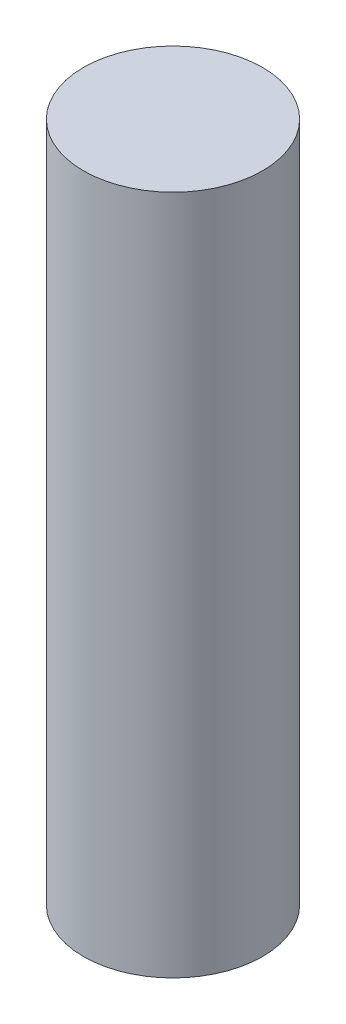
ISO-10303-21;
HEADER;
FILE_DESCRIPTION(('STEP AP214'),'2;1');
FILE_NAME('part.step','',(''),(''),'','','');
FILE_SCHEMA(('AUTOMOTIVE_DESIGN { 1 0 10303 214 1 1 1 1 }'));
ENDSEC;
DATA;
#1=APPLICATION_CONTEXT('core data for automotive mechanical design processes');
#2=APPLICATION_PROTOCOL_DEFINITION('international standard','automotive_design',2000,#1);
#3=PRODUCT_CONTEXT('',#1,'mechanical');
#4=PRODUCT('Part','Part','',(#3));
#5=PRODUCT_RELATED_PRODUCT_CATEGORY('part','',(#4));
#6=PRODUCT_DEFINITION_FORMATION('','',#4);
#7=PRODUCT_DEFINITION_CONTEXT('part definition',#1,'design');
#8=PRODUCT_DEFINITION('design','',#6,#7);
#9=PRODUCT_DEFINITION_SHAPE('','',#8);
#10=(LENGTH_UNIT() NAMED_UNIT(*) SI_UNIT(.MILLI.,.METRE.));
#11=(NAMED_UNIT(*) PLANE_ANGLE_UNIT() SI_UNIT($,.RADIAN.));
#12=(NAMED_UNIT(*) SI_UNIT($,.STERADIAN.) SOLID_ANGLE_UNIT());
#13=UNCERTAINTY_MEASURE_WITH_UNIT(LENGTH_MEASURE(1.E-05),#10,'distance_accuracy_value','');
#14=(GEOMETRIC_REPRESENTATION_CONTEXT(3) GLOBAL_UNCERTAINTY_ASSIGNED_CONTEXT((#13)) GLOBAL_UNIT_ASSIGNED_CONTEXT((#10,
#11,#12)) REPRESENTATION_CONTEXT('',''));
#15=CARTESIAN_POINT('',(0.,0.,0.));
#16=DIRECTION('',(0.,0.,1.));
#17=DIRECTION('',(1.,0.,0.));
#18=AXIS2_PLACEMENT_3D('',#15,#16,#17);
#19=CARTESIAN_POINT('',(0.,96.52,0.));
#20=DIRECTION('',(0.,-1.,0.));
#21=DIRECTION('',(0.,0.,-1.));
#22=AXIS2_PLACEMENT_3D('',#19,#20,#21);
#23=CYLINDRICAL_SURFACE('',#22,12.7);
#24=CARTESIAN_POINT('',(0.,96.52,0.));
#25=DIRECTION('',(0.,1.,0.));
#26=DIRECTION('',(0.,0.,1.));
#27=AXIS2_PLACEMENT_3D('',#24,#25,#26);
#28=CIRCLE('',#27,12.7);
#29=CARTESIAN_POINT('',(0.,96.52,-12.7));
#30=VERTEX_POINT('',#29);
#31=EDGE_CURVE('E10',#30,#30,#28,.T.);
#32=CARTESIAN_POINT('',(0.,0.,0.));
#33=DIRECTION('',(0.,1.,0.));
#34=DIRECTION('',(0.,0.,1.));
#35=AXIS2_PLACEMENT_3D('',#32,#33,#34);
#36=CIRCLE('',#35,12.7);
#37=CARTESIAN_POINT('',(0.,0.,-12.7));
#38=VERTEX_POINT('',#37);
#39=EDGE_CURVE('E46',#38,#38,#36,.T.);
#40=CARTESIAN_POINT('',(0.,96.52,-12.7));
#41=CARTESIAN_POINT('',(0.,95.5145833333333,-12.7));
#42=CARTESIAN_POINT('',(0.,94.5091666666666,-12.7));
#43=CARTESIAN_POINT('',(0.,92.4983333333333,-12.7));
#44=CARTESIAN_POINT('',(0.,91.4929166666666,-12.7));
#45=CARTESIAN_POINT('',(0.,89.4820833333333,-12.7));
#46=CARTESIAN_POINT('',(0.,88.4766666666666,-12.7));
#47=CARTESIAN_POINT('',(0.,86.4658333333333,-12.7));
#48=CARTESIAN_POINT('',(0.,85.4604166666666,-12.7));
#49=CARTESIAN_POINT('',(0.,83.4495833333333,-12.7));
#50=CARTESIAN_POINT('',(0.,82.4441666666666,-12.7));
#51=CARTESIAN_POINT('',(0.,80.4333333333333,-12.7));
#52=CARTESIAN_POINT('',(0.,79.4279166666666,-12.7));
#53=CARTESIAN_POINT('',(0.,77.4170833333333,-12.7));
#54=CARTESIAN_POINT('',(0.,76.4116666666667,-12.7));
#55=CARTESIAN_POINT('',(0.,74.4008333333333,-12.7));
#56=CARTESIAN_POINT('',(0.,73.3954166666667,-12.7));
#57=CARTESIAN_POINT('',(0.,71.3845833333333,-12.7));
#58=CARTESIAN_POINT('',(0.,70.3791666666666,-12.7));
#59=CARTESIAN_POINT('',(0.,68.3683333333333,-12.7));
#60=CARTESIAN_POINT('',(0.,67.3629166666666,-12.7));
#61=CARTESIAN_POINT('',(0.,65.3520833333333,-12.7));
#62=CARTESIAN_POINT('',(0.,64.3466666666666,-12.7));
#63=CARTESIAN_POINT('',(0.,62.3358333333333,-12.7));
#64=CARTESIAN_POINT('',(0.,61.3304166666667,-12.7));
#65=CARTESIAN_POINT('',(0.,59.3195833333333,-12.7));
#66=CARTESIAN_POINT('',(0.,58.3141666666667,-12.7));
#67=CARTESIAN_POINT('',(0.,56.3033333333333,-12.7));
#68=CARTESIAN_POINT('',(0.,55.2979166666667,-12.7));
#69=CARTESIAN_POINT('',(0.,53.2870833333333,-12.7));
#70=CARTESIAN_POINT('',(0.,52.2816666666667,-12.7));
#71=CARTESIAN_POINT('',(0.,50.2708333333333,-12.7));
#72=CARTESIAN_POINT('',(0.,49.2654166666667,-12.7));
#73=CARTESIAN_POINT('',(0.,47.2545833333333,-12.7));
#74=CARTESIAN_POINT('',(0.,46.2491666666667,-12.7));
#75=CARTESIAN_POINT('',(0.,44.2383333333333,-12.7));
#76=CARTESIAN_POINT('',(0.,43.2329166666667,-12.7));
#77=CARTESIAN_POINT('',(0.,41.2220833333333,-12.7));
#78=CARTESIAN_POINT('',(0.,40.2166666666667,-12.7));
#79=CARTESIAN_POINT('',(0.,38.2058333333333,-12.7));
#80=CARTESIAN_POINT('',(0.,37.2004166666667,-12.7));
#81=CARTESIAN_POINT('',(0.,35.1895833333333,-12.7));
#82=CARTESIAN_POINT('',(0.,34.1841666666667,-12.7));
#83=CARTESIAN_POINT('',(0.,32.1733333333333,-12.7));
#84=CARTESIAN_POINT('',(0.,31.1679166666667,-12.7));
#85=CARTESIAN_POINT('',(0.,29.1570833333333,-12.7));
#86=CARTESIAN_POINT('',(0.,28.1516666666667,-12.7));
#87=CARTESIAN_POINT('',(0.,26.1408333333333,-12.7));
#88=CARTESIAN_POINT('',(0.,25.1354166666667,-12.7));
#89=CARTESIAN_POINT('',(0.,23.1245833333333,-12.7));
#90=CARTESIAN_POINT('',(0.,22.1191666666667,-12.7));
#91=CARTESIAN_POINT('',(0.,20.1083333333333,-12.7));
#92=CARTESIAN_POINT('',(0.,19.1029166666667,-12.7));
#93=CARTESIAN_POINT('',(0.,17.0920833333333,-12.7));
#94=CARTESIAN_POINT('',(0.,16.0866666666667,-12.7));
#95=CARTESIAN_POINT('',(0.,14.0758333333333,-12.7));
#96=CARTESIAN_POINT('',(0.,13.0704166666667,-12.7));
#97=CARTESIAN_POINT('',(0.,11.0595833333333,-12.7));
#98=CARTESIAN_POINT('',(0.,10.0541666666667,-12.7));
#99=CARTESIAN_POINT('',(0.,8.04333333333331,-12.7));
#100=CARTESIAN_POINT('',(0.,7.03791666666665,-12.7));
#101=CARTESIAN_POINT('',(0.,5.02708333333332,-12.7));
#102=CARTESIAN_POINT('',(0.,4.02166666666665,-12.7));
#103=CARTESIAN_POINT('',(0.,2.01083333333332,-12.7));
#104=CARTESIAN_POINT('',(0.,1.00541666666665,-12.7));
#105=CARTESIAN_POINT('',(0.,0.,-12.7));
#106=B_SPLINE_CURVE_WITH_KNOTS('',3,(#40,#41,#42,#43,#44,#45,#46,#47,#48,#49,#50,#51,#52,#53,
#54,#55,#56,#57,#58,#59,#60,#61,#62,#63,#64,#65,#66,#67,#68,#69,#70,#71,#72,#73,#74,#75,#76,#77,
#78,#79,#80,#81,#82,#83,#84,#85,#86,#87,#88,#89,#90,#91,#92,#93,#94,#95,#96,#97,#98,#99,#100,
#101,#102,#103,#104,#105),.UNSPECIFIED.,.F.,.F.,(4,2,2,2,2,2,2,2,2,2,2,2,2,2,2,2,2,2,2,2,2,2,2,
2,2,2,2,2,2,2,2,2,4),(0.,3.01625,6.0325,9.04874999999999,12.065,15.08125,18.0975,21.11375,24.13,
27.14625,30.1625,33.17875,36.195,39.21125,42.2275,45.24375,48.26,51.27625,54.2925,57.30875,
60.325,63.34125,66.3575,69.37375,72.39,75.40625,78.4225,81.43875,84.455,87.47125,90.4875,
93.50375,96.52),.UNSPECIFIED.);
#107=EDGE_CURVE('BSEAM43',#30,#38,#106,.T.);
#108=ORIENTED_EDGE('',*,*,#31,.F.);
#109=ORIENTED_EDGE('',*,*,#39,.T.);
#110=ORIENTED_EDGE('',*,*,#107,.T.);
#111=ORIENTED_EDGE('',*,*,#107,.F.);
#112=EDGE_LOOP('',(#108,#110,#109,#111));
#113=FACE_BOUND('',#112,.T.);
#114=ADVANCED_FACE('F43',(#113),#23,.T.);
#115=CARTESIAN_POINT('',(0.,96.52,0.));
#116=DIRECTION('',(0.,1.,0.));
#117=DIRECTION('',(0.,0.,1.));
#118=AXIS2_PLACEMENT_3D('',#115,#116,#117);
#119=PLANE('',#118);
#120=ORIENTED_EDGE('',*,*,#31,.T.);
#121=EDGE_LOOP('',(#120));
#122=FACE_BOUND('',#121,.T.);
#123=ADVANCED_FACE('F58',(#122),#119,.T.);
#124=CARTESIAN_POINT('',(0.,0.,0.));
#125=DIRECTION('',(0.,1.,0.));
#126=DIRECTION('',(0.,0.,1.));
#127=AXIS2_PLACEMENT_3D('',#124,#125,#126);
#128=PLANE('',#127);
#129=ORIENTED_EDGE('',*,*,#39,.F.);
#130=EDGE_LOOP('',(#129));
#131=FACE_BOUND('',#130,.T.);
#132=ADVANCED_FACE('F56',(#131),#128,.F.);
#133=CLOSED_SHELL('',(#114,#123,#132));
#134=MANIFOLD_SOLID_BREP('B2',#133);
#135=ADVANCED_BREP_SHAPE_REPRESENTATION('',(#18,#134),#14);
#136=SHAPE_DEFINITION_REPRESENTATION(#9,#135);
ENDSEC;
END-ISO-10303-21;
